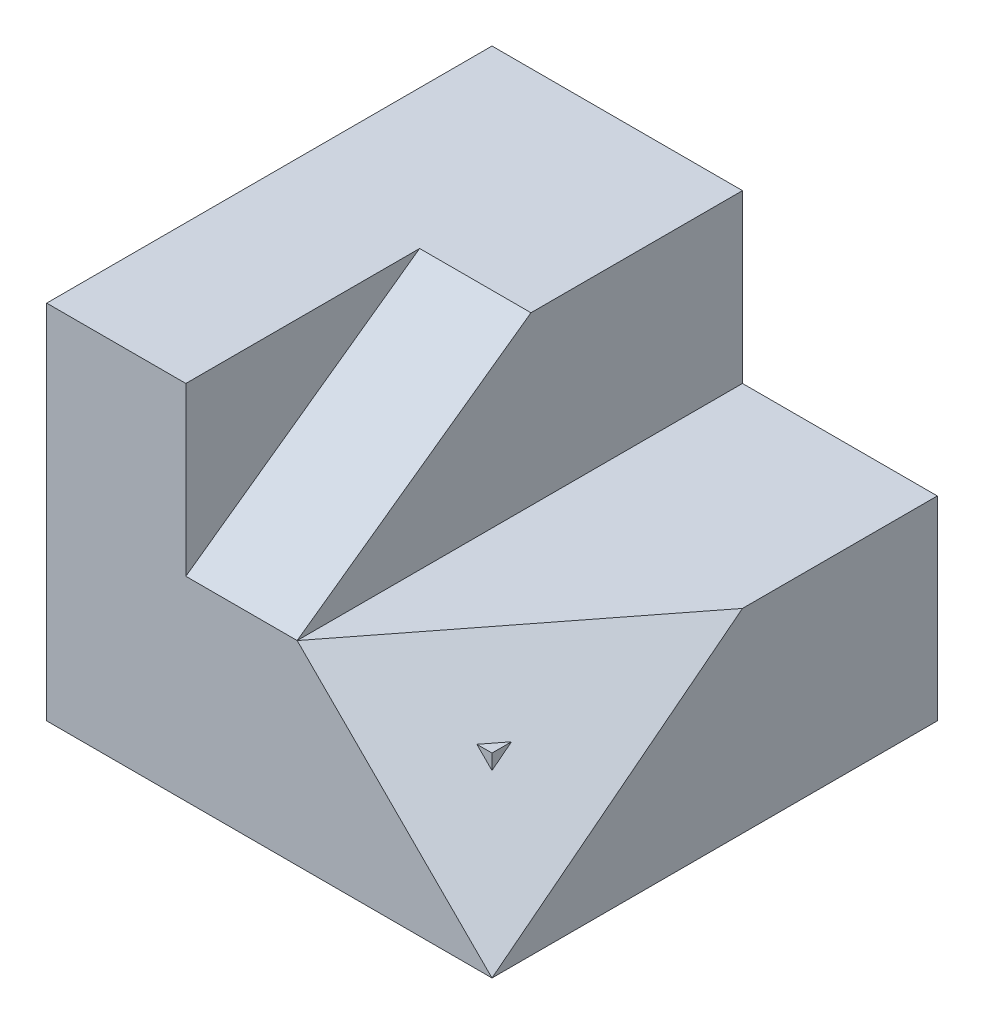
ISO-10303-21;
HEADER;
FILE_DESCRIPTION(('STEP AP214'),'2;1');
FILE_NAME('part.step','',(''),(''),'','','');
FILE_SCHEMA(('AUTOMOTIVE_DESIGN { 1 0 10303 214 1 1 1 1 }'));
ENDSEC;
DATA;
#1=APPLICATION_CONTEXT('core data for automotive mechanical design processes');
#2=APPLICATION_PROTOCOL_DEFINITION('international standard','automotive_design',2000,#1);
#3=PRODUCT_CONTEXT('',#1,'mechanical');
#4=PRODUCT('Part','Part','',(#3));
#5=PRODUCT_RELATED_PRODUCT_CATEGORY('part','',(#4));
#6=PRODUCT_DEFINITION_FORMATION('','',#4);
#7=PRODUCT_DEFINITION_CONTEXT('part definition',#1,'design');
#8=PRODUCT_DEFINITION('design','',#6,#7);
#9=PRODUCT_DEFINITION_SHAPE('','',#8);
#10=(LENGTH_UNIT() NAMED_UNIT(*) SI_UNIT(.MILLI.,.METRE.));
#11=(NAMED_UNIT(*) PLANE_ANGLE_UNIT() SI_UNIT($,.RADIAN.));
#12=(NAMED_UNIT(*) SI_UNIT($,.STERADIAN.) SOLID_ANGLE_UNIT());
#13=UNCERTAINTY_MEASURE_WITH_UNIT(LENGTH_MEASURE(1.E-05),#10,'distance_accuracy_value','');
#14=(GEOMETRIC_REPRESENTATION_CONTEXT(3) GLOBAL_UNCERTAINTY_ASSIGNED_CONTEXT((#13)) GLOBAL_UNIT_ASSIGNED_CONTEXT((#10,
#11,#12)) REPRESENTATION_CONTEXT('',''));
#15=CARTESIAN_POINT('',(0.,0.,0.));
#16=DIRECTION('',(0.,0.,1.));
#17=DIRECTION('',(1.,0.,0.));
#18=AXIS2_PLACEMENT_3D('',#15,#16,#17);
#19=CARTESIAN_POINT('',(40.,32.5,-80.));
#20=DIRECTION('',(1.,0.,0.));
#21=DIRECTION('',(0.,0.,-1.));
#22=AXIS2_PLACEMENT_3D('',#19,#20,#21);
#23=PLANE('',#22);
#24=DIRECTION('',(0.,0.,-1.));
#25=VECTOR('',#24,1.);
#26=CARTESIAN_POINT('',(40.,2.5,0.));
#27=LINE('',#26,#25);
#28=CARTESIAN_POINT('',(40.,2.5,-45.));
#29=VERTEX_POINT('',#28);
#30=CARTESIAN_POINT('',(40.,2.5,-80.));
#31=VERTEX_POINT('',#30);
#32=EDGE_CURVE('E55',#29,#31,#27,.T.);
#33=ORIENTED_EDGE('',*,*,#32,.F.);
#34=DIRECTION('',(0.,0.613940613514921,-0.789352217376326));
#35=VECTOR('',#34,1.);
#36=CARTESIAN_POINT('',(40.,2.50000000000002,-45.));
#37=LINE('',#36,#35);
#38=CARTESIAN_POINT('',(40.,-32.5,0.));
#39=VERTEX_POINT('',#38);
#40=EDGE_CURVE('E12',#39,#29,#37,.T.);
#41=ORIENTED_EDGE('',*,*,#40,.F.);
#42=DIRECTION('',(0.,0.,1.));
#43=VECTOR('',#42,1.);
#44=CARTESIAN_POINT('',(40.,-32.5,-80.));
#45=LINE('',#44,#43);
#46=CARTESIAN_POINT('',(40.,-32.5,-80.));
#47=VERTEX_POINT('',#46);
#48=EDGE_CURVE('E172',#47,#39,#45,.T.);
#49=ORIENTED_EDGE('',*,*,#48,.F.);
#50=DIRECTION('',(0.,1.,0.));
#51=VECTOR('',#50,1.);
#52=CARTESIAN_POINT('',(40.,32.5,-80.));
#53=LINE('',#52,#51);
#54=EDGE_CURVE('E167',#47,#31,#53,.T.);
#55=ORIENTED_EDGE('',*,*,#54,.T.);
#56=EDGE_LOOP('',(#33,#41,#49,#55));
#57=FACE_BOUND('',#56,.T.);
#58=ADVANCED_FACE('F47',(#57),#23,.T.);
#59=CARTESIAN_POINT('',(0.,0.,0.));
#60=DIRECTION('',(0.,0.,1.));
#61=DIRECTION('',(1.,0.,0.));
#62=AXIS2_PLACEMENT_3D('',#59,#60,#61);
#63=PLANE('',#62);
#64=DIRECTION('',(1.,0.,0.));
#65=VECTOR('',#64,1.);
#66=CARTESIAN_POINT('',(-40.,-32.5,0.));
#67=LINE('',#66,#65);
#68=CARTESIAN_POINT('',(-40.,-32.5,0.));
#69=VERTEX_POINT('',#68);
#70=EDGE_CURVE('E146',#69,#39,#67,.T.);
#71=ORIENTED_EDGE('',*,*,#70,.T.);
#72=DIRECTION('',(0.707106781186548,-0.707106781186548,0.));
#73=VECTOR('',#72,1.);
#74=CARTESIAN_POINT('',(40.,-32.5,0.));
#75=LINE('',#74,#73);
#76=CARTESIAN_POINT('',(4.99999999999998,2.5,0.));
#77=VERTEX_POINT('',#76);
#78=EDGE_CURVE('E59',#77,#39,#75,.T.);
#79=ORIENTED_EDGE('',*,*,#78,.F.);
#80=DIRECTION('',(1.,0.,0.));
#81=VECTOR('',#80,1.);
#82=CARTESIAN_POINT('',(-15.,2.5,0.));
#83=LINE('',#82,#81);
#84=CARTESIAN_POINT('',(-15.,2.5,0.));
#85=VERTEX_POINT('',#84);
#86=EDGE_CURVE('E124',#85,#77,#83,.T.);
#87=ORIENTED_EDGE('',*,*,#86,.F.);
#88=DIRECTION('',(0.,-1.,0.));
#89=VECTOR('',#88,1.);
#90=CARTESIAN_POINT('',(-15.,0.,0.));
#91=LINE('',#90,#89);
#92=CARTESIAN_POINT('',(-15.,32.5,0.));
#93=VERTEX_POINT('',#92);
#94=EDGE_CURVE('E122',#93,#85,#91,.T.);
#95=ORIENTED_EDGE('',*,*,#94,.F.);
#96=DIRECTION('',(-1.,0.,0.));
#97=VECTOR('',#96,1.);
#98=CARTESIAN_POINT('',(-40.,32.5,0.));
#99=LINE('',#98,#97);
#100=CARTESIAN_POINT('',(-40.,32.5,0.));
#101=VERTEX_POINT('',#100);
#102=EDGE_CURVE('E133',#93,#101,#99,.T.);
#103=ORIENTED_EDGE('',*,*,#102,.T.);
#104=DIRECTION('',(0.,-1.,0.));
#105=VECTOR('',#104,1.);
#106=CARTESIAN_POINT('',(-40.,32.5,0.));
#107=LINE('',#106,#105);
#108=EDGE_CURVE('E180',#101,#69,#107,.T.);
#109=ORIENTED_EDGE('',*,*,#108,.T.);
#110=EDGE_LOOP('',(#71,#79,#87,#95,#103,#109));
#111=FACE_BOUND('',#110,.T.);
#112=ADVANCED_FACE('F144',(#111),#63,.T.);
#113=CARTESIAN_POINT('',(4.99999999999998,2.5,0.));
#114=DIRECTION('',(0.,-1.,0.));
#115=DIRECTION('',(0.,0.,-1.));
#116=AXIS2_PLACEMENT_3D('',#113,#114,#115);
#117=PLANE('',#116);
#118=DIRECTION('',(-0.61394061351492,0.,0.789352217376326));
#119=VECTOR('',#118,1.);
#120=CARTESIAN_POINT('',(4.99999999999998,2.5,0.));
#121=LINE('',#120,#119);
#122=EDGE_CURVE('E132',#29,#77,#121,.T.);
#123=ORIENTED_EDGE('',*,*,#122,.F.);
#124=ORIENTED_EDGE('',*,*,#32,.T.);
#125=DIRECTION('',(1.,0.,0.));
#126=VECTOR('',#125,1.);
#127=CARTESIAN_POINT('',(4.99999999999998,2.5,-80.));
#128=LINE('',#127,#126);
#129=CARTESIAN_POINT('',(4.99999999999998,2.5,-80.));
#130=VERTEX_POINT('',#129);
#131=EDGE_CURVE('E127',#130,#31,#128,.T.);
#132=ORIENTED_EDGE('',*,*,#131,.F.);
#133=DIRECTION('',(0.,0.,-1.));
#134=VECTOR('',#133,1.);
#135=CARTESIAN_POINT('',(4.99999999999998,2.5,0.));
#136=LINE('',#135,#134);
#137=EDGE_CURVE('E155',#77,#130,#136,.T.);
#138=ORIENTED_EDGE('',*,*,#137,.F.);
#139=EDGE_LOOP('',(#123,#124,#132,#138));
#140=FACE_BOUND('',#139,.T.);
#141=ADVANCED_FACE('F154',(#140),#117,.F.);
#142=CARTESIAN_POINT('',(-40.,32.5,-80.));
#143=DIRECTION('',(0.,1.,0.));
#144=DIRECTION('',(0.,0.,1.));
#145=AXIS2_PLACEMENT_3D('',#142,#143,#144);
#146=PLANE('',#145);
#147=DIRECTION('',(0.,0.,1.));
#148=VECTOR('',#147,1.);
#149=CARTESIAN_POINT('',(-15.,32.5,0.));
#150=LINE('',#149,#148);
#151=CARTESIAN_POINT('',(-15.,32.5,-42.));
#152=VERTEX_POINT('',#151);
#153=EDGE_CURVE('E121',#152,#93,#150,.T.);
#154=ORIENTED_EDGE('',*,*,#153,.F.);
#155=DIRECTION('',(1.,0.,0.));
#156=VECTOR('',#155,1.);
#157=CARTESIAN_POINT('',(-15.,32.5,-42.));
#158=LINE('',#157,#156);
#159=CARTESIAN_POINT('',(4.99999999999998,32.5,-42.));
#160=VERTEX_POINT('',#159);
#161=EDGE_CURVE('E104',#152,#160,#158,.T.);
#162=ORIENTED_EDGE('',*,*,#161,.T.);
#163=DIRECTION('',(0.,0.,1.));
#164=VECTOR('',#163,1.);
#165=CARTESIAN_POINT('',(4.99999999999998,32.5,0.));
#166=LINE('',#165,#164);
#167=CARTESIAN_POINT('',(4.99999999999998,32.5,-80.));
#168=VERTEX_POINT('',#167);
#169=EDGE_CURVE('E152',#168,#160,#166,.T.);
#170=ORIENTED_EDGE('',*,*,#169,.F.);
#171=DIRECTION('',(-1.,0.,0.));
#172=VECTOR('',#171,1.);
#173=CARTESIAN_POINT('',(-40.,32.5,-80.));
#174=LINE('',#173,#172);
#175=CARTESIAN_POINT('',(-40.,32.5,-80.));
#176=VERTEX_POINT('',#175);
#177=EDGE_CURVE('E119',#168,#176,#174,.T.);
#178=ORIENTED_EDGE('',*,*,#177,.T.);
#179=DIRECTION('',(0.,0.,1.));
#180=VECTOR('',#179,1.);
#181=CARTESIAN_POINT('',(-40.,32.5,-80.));
#182=LINE('',#181,#180);
#183=EDGE_CURVE('E162',#176,#101,#182,.T.);
#184=ORIENTED_EDGE('',*,*,#183,.T.);
#185=ORIENTED_EDGE('',*,*,#102,.F.);
#186=EDGE_LOOP('',(#154,#162,#170,#178,#184,#185));
#187=FACE_BOUND('',#186,.T.);
#188=ADVANCED_FACE('F129',(#187),#146,.T.);
#189=CARTESIAN_POINT('',(4.99999999999998,0.,0.));
#190=DIRECTION('',(1.,0.,0.));
#191=DIRECTION('',(0.,0.,-1.));
#192=AXIS2_PLACEMENT_3D('',#189,#190,#191);
#193=PLANE('',#192);
#194=ORIENTED_EDGE('',*,*,#169,.T.);
#195=DIRECTION('',(0.,-0.581238193719096,0.813733471206735));
#196=VECTOR('',#195,1.);
#197=CARTESIAN_POINT('',(4.99999999999998,1.65540540540541,1.18243243243243));
#198=LINE('',#197,#196);
#199=EDGE_CURVE('E115',#160,#77,#198,.T.);
#200=ORIENTED_EDGE('',*,*,#199,.T.);
#201=ORIENTED_EDGE('',*,*,#137,.T.);
#202=DIRECTION('',(0.,1.,0.));
#203=VECTOR('',#202,1.);
#204=CARTESIAN_POINT('',(4.99999999999998,32.5,-80.));
#205=LINE('',#204,#203);
#206=EDGE_CURVE('E160',#130,#168,#205,.T.);
#207=ORIENTED_EDGE('',*,*,#206,.T.);
#208=EDGE_LOOP('',(#194,#200,#201,#207));
#209=FACE_BOUND('',#208,.T.);
#210=ADVANCED_FACE('F151',(#209),#193,.T.);
#211=CARTESIAN_POINT('',(-40.,-32.5,-80.));
#212=DIRECTION('',(0.,-1.,0.));
#213=DIRECTION('',(0.,0.,-1.));
#214=AXIS2_PLACEMENT_3D('',#211,#212,#213);
#215=PLANE('',#214);
#216=ORIENTED_EDGE('',*,*,#70,.F.);
#217=DIRECTION('',(0.,0.,1.));
#218=VECTOR('',#217,1.);
#219=CARTESIAN_POINT('',(-40.,-32.5,-80.));
#220=LINE('',#219,#218);
#221=CARTESIAN_POINT('',(-40.,-32.5,-80.));
#222=VERTEX_POINT('',#221);
#223=EDGE_CURVE('E164',#222,#69,#220,.T.);
#224=ORIENTED_EDGE('',*,*,#223,.F.);
#225=DIRECTION('',(1.,0.,0.));
#226=VECTOR('',#225,1.);
#227=CARTESIAN_POINT('',(-40.,-32.5,-80.));
#228=LINE('',#227,#226);
#229=EDGE_CURVE('E157',#222,#47,#228,.T.);
#230=ORIENTED_EDGE('',*,*,#229,.T.);
#231=ORIENTED_EDGE('',*,*,#48,.T.);
#232=EDGE_LOOP('',(#216,#224,#230,#231));
#233=FACE_BOUND('',#232,.T.);
#234=ADVANCED_FACE('F186',(#233),#215,.T.);
#235=CARTESIAN_POINT('',(-40.,32.5,-80.));
#236=DIRECTION('',(-1.,0.,0.));
#237=DIRECTION('',(0.,-1.,0.));
#238=AXIS2_PLACEMENT_3D('',#235,#236,#237);
#239=PLANE('',#238);
#240=ORIENTED_EDGE('',*,*,#108,.F.);
#241=ORIENTED_EDGE('',*,*,#183,.F.);
#242=DIRECTION('',(0.,-1.,0.));
#243=VECTOR('',#242,1.);
#244=CARTESIAN_POINT('',(-40.,32.5,-80.));
#245=LINE('',#244,#243);
#246=EDGE_CURVE('E168',#176,#222,#245,.T.);
#247=ORIENTED_EDGE('',*,*,#246,.T.);
#248=ORIENTED_EDGE('',*,*,#223,.T.);
#249=EDGE_LOOP('',(#240,#241,#247,#248));
#250=FACE_BOUND('',#249,.T.);
#251=ADVANCED_FACE('F187',(#250),#239,.T.);
#252=CARTESIAN_POINT('',(0.,0.,-80.));
#253=DIRECTION('',(0.,0.,1.));
#254=DIRECTION('',(1.,0.,0.));
#255=AXIS2_PLACEMENT_3D('',#252,#253,#254);
#256=PLANE('',#255);
#257=ORIENTED_EDGE('',*,*,#206,.F.);
#258=ORIENTED_EDGE('',*,*,#131,.T.);
#259=ORIENTED_EDGE('',*,*,#54,.F.);
#260=ORIENTED_EDGE('',*,*,#229,.F.);
#261=ORIENTED_EDGE('',*,*,#246,.F.);
#262=ORIENTED_EDGE('',*,*,#177,.F.);
#263=EDGE_LOOP('',(#257,#258,#259,#260,#261,#262));
#264=FACE_BOUND('',#263,.T.);
#265=ADVANCED_FACE('F194',(#264),#256,.F.);
#266=CARTESIAN_POINT('',(-15.,1.65540540540541,1.18243243243243));
#267=DIRECTION('',(0.,0.813733471206735,0.581238193719096));
#268=DIRECTION('',(0.,-0.581238193719096,0.813733471206735));
#269=AXIS2_PLACEMENT_3D('',#266,#267,#268);
#270=PLANE('',#269);
#271=ORIENTED_EDGE('',*,*,#199,.F.);
#272=ORIENTED_EDGE('',*,*,#161,.F.);
#273=DIRECTION('',(0.,-0.581238193719096,0.813733471206735));
#274=VECTOR('',#273,1.);
#275=CARTESIAN_POINT('',(-15.,1.65540540540541,1.18243243243243));
#276=LINE('',#275,#274);
#277=EDGE_CURVE('E108',#152,#85,#276,.T.);
#278=ORIENTED_EDGE('',*,*,#277,.T.);
#279=ORIENTED_EDGE('',*,*,#86,.T.);
#280=EDGE_LOOP('',(#271,#272,#278,#279));
#281=FACE_BOUND('',#280,.T.);
#282=ADVANCED_FACE('F110',(#281),#270,.T.);
#283=CARTESIAN_POINT('',(-15.,0.,0.));
#284=DIRECTION('',(1.,0.,0.));
#285=DIRECTION('',(0.,0.,-1.));
#286=AXIS2_PLACEMENT_3D('',#283,#284,#285);
#287=PLANE('',#286);
#288=ORIENTED_EDGE('',*,*,#277,.F.);
#289=ORIENTED_EDGE('',*,*,#153,.T.);
#290=ORIENTED_EDGE('',*,*,#94,.T.);
#291=EDGE_LOOP('',(#288,#289,#290));
#292=FACE_BOUND('',#291,.T.);
#293=ADVANCED_FACE('F116',(#292),#287,.T.);
#294=CARTESIAN_POINT('',(2.87914691943127,2.87914691943127,2.23933649289099));
#295=DIRECTION('',(0.619585551739363,0.619585551739363,0.48189987357506));
#296=DIRECTION('',(-0.707106781186548,0.707106781186547,0.));
#297=AXIS2_PLACEMENT_3D('',#294,#295,#296);
#298=PLANE('',#297);
#299=ORIENTED_EDGE('',*,*,#122,.T.);
#300=ORIENTED_EDGE('',*,*,#78,.T.);
#301=ORIENTED_EDGE('',*,*,#40,.T.);
#302=EDGE_LOOP('',(#299,#300,#301));
#303=FACE_BOUND('',#302,.T.);
#304=ADVANCED_FACE('F138',(#303),#298,.T.);
#305=CLOSED_SHELL('',(#58,#112,#141,#188,#210,#234,#251,#265,#282,#293,#304));
#306=MANIFOLD_SOLID_BREP('B2',#305);
#307=CARTESIAN_POINT('',(4.99999999999998,2.5,0.));
#308=DIRECTION('',(0.,-1.,0.));
#309=DIRECTION('',(0.,0.,-1.));
#310=AXIS2_PLACEMENT_3D('',#307,#308,#309);
#311=PLANE('',#310);
#312=DIRECTION('',(0.,0.,-1.));
#313=VECTOR('',#312,1.);
#314=CARTESIAN_POINT('',(40.,2.5,0.));
#315=LINE('',#314,#313);
#316=CARTESIAN_POINT('',(40.,2.5,0.));
#317=VERTEX_POINT('',#316);
#318=CARTESIAN_POINT('',(40.,2.5,-3.49760272476014));
#319=VERTEX_POINT('',#318);
#320=EDGE_CURVE('E320',#317,#319,#315,.T.);
#321=ORIENTED_EDGE('',*,*,#320,.T.);
#322=DIRECTION('',(-0.613940613514921,0.,0.789352217376326));
#323=VECTOR('',#322,1.);
#324=CARTESIAN_POINT('',(25.1127002180008,2.5,15.6432112806673));
#325=LINE('',#324,#323);
#326=CARTESIAN_POINT('',(37.2796423251865,2.5,0.));
#327=VERTEX_POINT('',#326);
#328=EDGE_CURVE('E50',#319,#327,#325,.T.);
#329=ORIENTED_EDGE('',*,*,#328,.T.);
#330=DIRECTION('',(1.,0.,0.));
#331=VECTOR('',#330,1.);
#332=CARTESIAN_POINT('',(4.99999999999998,2.5,0.));
#333=LINE('',#332,#331);
#334=EDGE_CURVE('E317',#327,#317,#333,.T.);
#335=ORIENTED_EDGE('',*,*,#334,.T.);
#336=EDGE_LOOP('',(#321,#329,#335));
#337=FACE_BOUND('',#336,.T.);
#338=ADVANCED_FACE('F281',(#337),#311,.F.);
#339=CARTESIAN_POINT('',(0.,0.,0.));
#340=DIRECTION('',(0.,0.,1.));
#341=DIRECTION('',(1.,0.,0.));
#342=AXIS2_PLACEMENT_3D('',#339,#340,#341);
#343=PLANE('',#342);
#344=DIRECTION('',(-0.707106781186548,0.707106781186547,0.));
#345=VECTOR('',#344,1.);
#346=CARTESIAN_POINT('',(19.8898211625933,19.8898211625933,0.));
#347=LINE('',#346,#345);
#348=CARTESIAN_POINT('',(40.,-0.220357674813442,0.));
#349=VERTEX_POINT('',#348);
#350=EDGE_CURVE('E296',#349,#327,#347,.T.);
#351=ORIENTED_EDGE('',*,*,#350,.F.);
#352=DIRECTION('',(0.,1.,0.));
#353=VECTOR('',#352,1.);
#354=CARTESIAN_POINT('',(40.,32.5,0.));
#355=LINE('',#354,#353);
#356=EDGE_CURVE('E291',#349,#317,#355,.T.);
#357=ORIENTED_EDGE('',*,*,#356,.T.);
#358=ORIENTED_EDGE('',*,*,#334,.F.);
#359=EDGE_LOOP('',(#351,#357,#358));
#360=FACE_BOUND('',#359,.T.);
#361=ADVANCED_FACE('F323',(#360),#343,.T.);
#362=CARTESIAN_POINT('',(40.,32.5,-80.));
#363=DIRECTION('',(1.,0.,0.));
#364=DIRECTION('',(0.,0.,-1.));
#365=AXIS2_PLACEMENT_3D('',#362,#363,#364);
#366=PLANE('',#365);
#367=DIRECTION('',(0.,-0.61394061351492,0.789352217376326));
#368=VECTOR('',#367,1.);
#369=CARTESIAN_POINT('',(40.,50.8819309872316,-65.7029425654865));
#370=LINE('',#369,#368);
#371=EDGE_CURVE('E315',#319,#349,#370,.T.);
#372=ORIENTED_EDGE('',*,*,#371,.F.);
#373=ORIENTED_EDGE('',*,*,#320,.F.);
#374=ORIENTED_EDGE('',*,*,#356,.F.);
#375=EDGE_LOOP('',(#372,#373,#374));
#376=FACE_BOUND('',#375,.T.);
#377=ADVANCED_FACE('F290',(#376),#366,.T.);
#378=CARTESIAN_POINT('',(15.2708579542185,15.2708579542185,11.8773339643922));
#379=DIRECTION('',(0.619585551739363,0.619585551739363,0.48189987357506));
#380=DIRECTION('',(-0.707106781186548,0.707106781186547,0.));
#381=AXIS2_PLACEMENT_3D('',#378,#379,#380);
#382=PLANE('',#381);
#383=ORIENTED_EDGE('',*,*,#371,.T.);
#384=ORIENTED_EDGE('',*,*,#350,.T.);
#385=ORIENTED_EDGE('',*,*,#328,.F.);
#386=EDGE_LOOP('',(#383,#384,#385));
#387=FACE_BOUND('',#386,.T.);
#388=ADVANCED_FACE('F313',(#387),#382,.F.);
#389=CLOSED_SHELL('',(#338,#361,#377,#388));
#390=MANIFOLD_SOLID_BREP('B6',#389);
#391=ADVANCED_BREP_SHAPE_REPRESENTATION('',(#18,#306,#390),#14);
#392=SHAPE_DEFINITION_REPRESENTATION(#9,#391);
ENDSEC;
END-ISO-10303-21;
